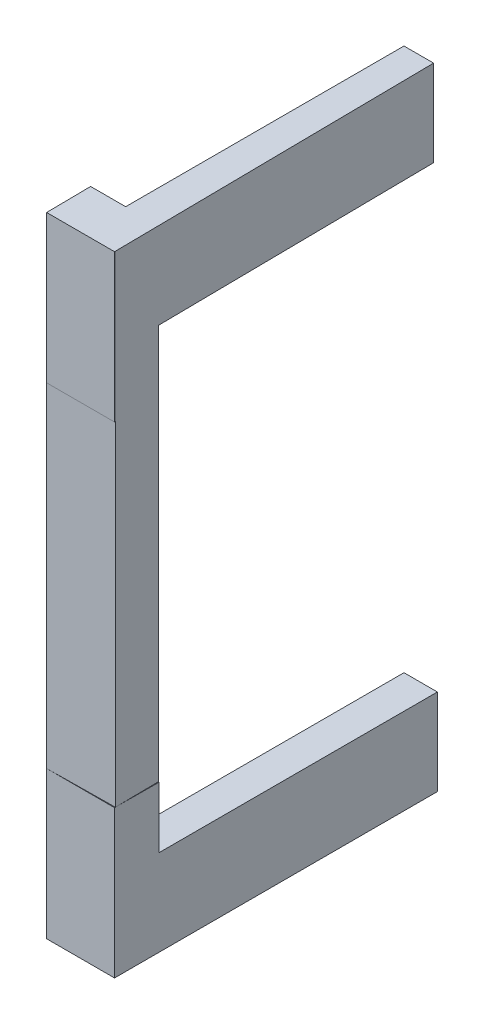
ISO-10303-21;
HEADER;
FILE_DESCRIPTION(('STEP AP214'),'2;1');
FILE_NAME('part.step','',(''),(''),'','','');
FILE_SCHEMA(('AUTOMOTIVE_DESIGN { 1 0 10303 214 1 1 1 1 }'));
ENDSEC;
DATA;
#1=APPLICATION_CONTEXT('core data for automotive mechanical design processes');
#2=APPLICATION_PROTOCOL_DEFINITION('international standard','automotive_design',2000,#1);
#3=PRODUCT_CONTEXT('',#1,'mechanical');
#4=PRODUCT('Part','Part','',(#3));
#5=PRODUCT_RELATED_PRODUCT_CATEGORY('part','',(#4));
#6=PRODUCT_DEFINITION_FORMATION('','',#4);
#7=PRODUCT_DEFINITION_CONTEXT('part definition',#1,'design');
#8=PRODUCT_DEFINITION('design','',#6,#7);
#9=PRODUCT_DEFINITION_SHAPE('','',#8);
#10=(LENGTH_UNIT() NAMED_UNIT(*) SI_UNIT(.MILLI.,.METRE.));
#11=(NAMED_UNIT(*) PLANE_ANGLE_UNIT() SI_UNIT($,.RADIAN.));
#12=(NAMED_UNIT(*) SI_UNIT($,.STERADIAN.) SOLID_ANGLE_UNIT());
#13=UNCERTAINTY_MEASURE_WITH_UNIT(LENGTH_MEASURE(1.E-05),#10,'distance_accuracy_value','');
#14=(GEOMETRIC_REPRESENTATION_CONTEXT(3) GLOBAL_UNCERTAINTY_ASSIGNED_CONTEXT((#13)) GLOBAL_UNIT_ASSIGNED_CONTEXT((#10,
#11,#12)) REPRESENTATION_CONTEXT('',''));
#15=CARTESIAN_POINT('',(0.,0.,0.));
#16=DIRECTION('',(0.,0.,1.));
#17=DIRECTION('',(1.,0.,0.));
#18=AXIS2_PLACEMENT_3D('',#15,#16,#17);
#19=CARTESIAN_POINT('',(-13.1,30.,-12.8));
#20=DIRECTION('',(0.,0.,-1.));
#21=DIRECTION('',(-1.,0.,0.));
#22=AXIS2_PLACEMENT_3D('',#19,#20,#21);
#23=PLANE('',#22);
#24=DIRECTION('',(0.,-1.,0.));
#25=VECTOR('',#24,1.);
#26=CARTESIAN_POINT('',(-10.9998132817287,-5.5,-12.8));
#27=LINE('',#26,#25);
#28=CARTESIAN_POINT('',(-10.9998132817287,0.,-12.8));
#29=VERTEX_POINT('',#28);
#30=CARTESIAN_POINT('',(-10.9998132817287,-13.25,-12.8));
#31=VERTEX_POINT('',#30);
#32=EDGE_CURVE('E236',#29,#31,#27,.T.);
#33=ORIENTED_EDGE('',*,*,#32,.F.);
#34=DIRECTION('',(1.,0.,0.));
#35=VECTOR('',#34,1.);
#36=CARTESIAN_POINT('',(0.,0.,-12.8));
#37=LINE('',#36,#35);
#38=CARTESIAN_POINT('',(-17.1002746487741,0.,-12.8));
#39=VERTEX_POINT('',#38);
#40=EDGE_CURVE('E164',#39,#29,#37,.T.);
#41=ORIENTED_EDGE('',*,*,#40,.F.);
#42=DIRECTION('',(0.,-1.,0.));
#43=VECTOR('',#42,1.);
#44=CARTESIAN_POINT('',(-17.1002746487741,-13.25,-12.8));
#45=LINE('',#44,#43);
#46=CARTESIAN_POINT('',(-17.1002746487741,-13.25,-12.8));
#47=VERTEX_POINT('',#46);
#48=EDGE_CURVE('E191',#39,#47,#45,.T.);
#49=ORIENTED_EDGE('',*,*,#48,.T.);
#50=DIRECTION('',(-1.,0.,0.));
#51=VECTOR('',#50,1.);
#52=CARTESIAN_POINT('',(-10.9998132817287,-13.25,-12.8));
#53=LINE('',#52,#51);
#54=EDGE_CURVE('E184',#31,#47,#53,.T.);
#55=ORIENTED_EDGE('',*,*,#54,.F.);
#56=EDGE_LOOP('',(#33,#41,#49,#55));
#57=FACE_BOUND('',#56,.T.);
#58=ADVANCED_FACE('F33',(#57),#23,.F.);
#59=CARTESIAN_POINT('',(-13.9998132817287,35.5,-12.8));
#60=DIRECTION('',(-1.,0.,0.));
#61=DIRECTION('',(0.,0.,1.));
#62=AXIS2_PLACEMENT_3D('',#59,#60,#61);
#63=PLANE('',#62);
#64=DIRECTION('',(0.,0.,1.));
#65=VECTOR('',#64,1.);
#66=CARTESIAN_POINT('',(-13.9998132817287,-13.25,-41.8));
#67=LINE('',#66,#65);
#68=CARTESIAN_POINT('',(-13.9998132817287,-13.25,-41.8));
#69=VERTEX_POINT('',#68);
#70=CARTESIAN_POINT('',(-13.9998132817287,-13.25,-16.8));
#71=VERTEX_POINT('',#70);
#72=EDGE_CURVE('E56',#69,#71,#67,.T.);
#73=ORIENTED_EDGE('',*,*,#72,.T.);
#74=DIRECTION('',(0.,-1.,0.));
#75=VECTOR('',#74,1.);
#76=CARTESIAN_POINT('',(-13.9998132817287,43.25,-16.8));
#77=LINE('',#76,#75);
#78=CARTESIAN_POINT('',(-13.9998132817287,-5.5,-16.8));
#79=VERTEX_POINT('',#78);
#80=EDGE_CURVE('E169',#79,#71,#77,.T.);
#81=ORIENTED_EDGE('',*,*,#80,.F.);
#82=DIRECTION('',(0.,0.,1.));
#83=VECTOR('',#82,1.);
#84=CARTESIAN_POINT('',(-13.9998132817287,-5.50000000000001,-41.8));
#85=LINE('',#84,#83);
#86=CARTESIAN_POINT('',(-13.9998132817287,-5.50000000000001,-41.8));
#87=VERTEX_POINT('',#86);
#88=EDGE_CURVE('E206',#87,#79,#85,.T.);
#89=ORIENTED_EDGE('',*,*,#88,.F.);
#90=DIRECTION('',(0.,1.,0.));
#91=VECTOR('',#90,1.);
#92=CARTESIAN_POINT('',(-13.9998132817287,-5.50000000000001,-41.8));
#93=LINE('',#92,#91);
#94=EDGE_CURVE('E200',#69,#87,#93,.T.);
#95=ORIENTED_EDGE('',*,*,#94,.F.);
#96=EDGE_LOOP('',(#73,#81,#89,#95));
#97=FACE_BOUND('',#96,.T.);
#98=ADVANCED_FACE('F305',(#97),#63,.T.);
#99=DIRECTION('',(0.,0.,1.));
#100=VECTOR('',#99,1.);
#101=CARTESIAN_POINT('',(-13.9998132817287,35.5,-41.8));
#102=LINE('',#101,#100);
#103=CARTESIAN_POINT('',(-13.9998132817287,35.5,-41.8));
#104=VERTEX_POINT('',#103);
#105=CARTESIAN_POINT('',(-13.9998132817287,35.5,-16.8));
#106=VERTEX_POINT('',#105);
#107=EDGE_CURVE('E228',#104,#106,#102,.T.);
#108=ORIENTED_EDGE('',*,*,#107,.T.);
#109=CARTESIAN_POINT('',(-13.9998132817287,43.25,-16.8));
#110=VERTEX_POINT('',#109);
#111=EDGE_CURVE('E172',#110,#106,#77,.T.);
#112=ORIENTED_EDGE('',*,*,#111,.F.);
#113=DIRECTION('',(0.,0.,1.));
#114=VECTOR('',#113,1.);
#115=CARTESIAN_POINT('',(-13.9998132817287,43.25,-41.8));
#116=LINE('',#115,#114);
#117=CARTESIAN_POINT('',(-13.9998132817287,43.25,-41.8));
#118=VERTEX_POINT('',#117);
#119=EDGE_CURVE('E225',#118,#110,#116,.T.);
#120=ORIENTED_EDGE('',*,*,#119,.F.);
#121=DIRECTION('',(0.,1.,0.));
#122=VECTOR('',#121,1.);
#123=CARTESIAN_POINT('',(-13.9998132817287,35.5,-41.8));
#124=LINE('',#123,#122);
#125=EDGE_CURVE('E218',#104,#118,#124,.T.);
#126=ORIENTED_EDGE('',*,*,#125,.F.);
#127=EDGE_LOOP('',(#108,#112,#120,#126));
#128=FACE_BOUND('',#127,.T.);
#129=ADVANCED_FACE('F277',(#128),#63,.T.);
#130=DIRECTION('',(1.,0.,0.));
#131=VECTOR('',#130,1.);
#132=CARTESIAN_POINT('',(0.,30.,-12.8));
#133=LINE('',#132,#131);
#134=CARTESIAN_POINT('',(-17.1002746487741,30.,-12.8));
#135=VERTEX_POINT('',#134);
#136=CARTESIAN_POINT('',(-10.9998132817287,30.,-12.8));
#137=VERTEX_POINT('',#136);
#138=EDGE_CURVE('E235',#135,#137,#133,.T.);
#139=ORIENTED_EDGE('',*,*,#138,.T.);
#140=CARTESIAN_POINT('',(-10.9998132817287,43.25,-12.8));
#141=VERTEX_POINT('',#140);
#142=EDGE_CURVE('E232',#141,#137,#27,.T.);
#143=ORIENTED_EDGE('',*,*,#142,.F.);
#144=DIRECTION('',(1.,0.,0.));
#145=VECTOR('',#144,1.);
#146=CARTESIAN_POINT('',(-10.9998132817287,43.25,-12.8));
#147=LINE('',#146,#145);
#148=CARTESIAN_POINT('',(-17.1002746487741,43.25,-12.8));
#149=VERTEX_POINT('',#148);
#150=EDGE_CURVE('E213',#149,#141,#147,.T.);
#151=ORIENTED_EDGE('',*,*,#150,.F.);
#152=EDGE_CURVE('E182',#149,#135,#45,.T.);
#153=ORIENTED_EDGE('',*,*,#152,.T.);
#154=EDGE_LOOP('',(#139,#143,#151,#153));
#155=FACE_BOUND('',#154,.T.);
#156=ADVANCED_FACE('F35',(#155),#23,.F.);
#157=CARTESIAN_POINT('',(-17.1471496487741,30.,-16.8));
#158=DIRECTION('',(0.,0.,1.));
#159=DIRECTION('',(1.,0.,0.));
#160=AXIS2_PLACEMENT_3D('',#157,#158,#159);
#161=PLANE('',#160);
#162=DIRECTION('',(0.,-1.,0.));
#163=VECTOR('',#162,1.);
#164=CARTESIAN_POINT('',(-11.0458505108501,30.,-16.8));
#165=LINE('',#164,#163);
#166=CARTESIAN_POINT('',(-11.0458505108501,35.5,-16.8));
#167=VERTEX_POINT('',#166);
#168=CARTESIAN_POINT('',(-11.0458505108501,0.,-16.8));
#169=VERTEX_POINT('',#168);
#170=EDGE_CURVE('E285',#167,#169,#165,.T.);
#171=ORIENTED_EDGE('',*,*,#170,.T.);
#172=DIRECTION('',(0.956445869362801,-0.291909744576703,0.));
#173=VECTOR('',#172,1.);
#174=CARTESIAN_POINT('',(-25.0031261065873,4.25979648681284,-16.8));
#175=LINE('',#174,#173);
#176=CARTESIAN_POINT('',(-10.9998132817287,-0.0140506809891763,-16.8));
#177=VERTEX_POINT('',#176);
#178=EDGE_CURVE('E141',#169,#177,#175,.T.);
#179=ORIENTED_EDGE('',*,*,#178,.T.);
#180=DIRECTION('',(0.,-1.,0.));
#181=VECTOR('',#180,1.);
#182=CARTESIAN_POINT('',(-10.9998132817287,-5.5,-16.8));
#183=LINE('',#182,#181);
#184=CARTESIAN_POINT('',(-10.9998132817287,-5.50000000000001,-16.8));
#185=VERTEX_POINT('',#184);
#186=EDGE_CURVE('E158',#177,#185,#183,.T.);
#187=ORIENTED_EDGE('',*,*,#186,.T.);
#188=DIRECTION('',(-1.,0.,0.));
#189=VECTOR('',#188,1.);
#190=CARTESIAN_POINT('',(-10.9998132817287,-5.5,-16.8));
#191=LINE('',#190,#189);
#192=EDGE_CURVE('E231',#185,#79,#191,.T.);
#193=ORIENTED_EDGE('',*,*,#192,.T.);
#194=ORIENTED_EDGE('',*,*,#80,.T.);
#195=DIRECTION('',(1.,0.,0.));
#196=VECTOR('',#195,1.);
#197=CARTESIAN_POINT('',(-73.7670726534593,-13.25,-16.8));
#198=LINE('',#197,#196);
#199=CARTESIAN_POINT('',(-17.1471496487741,-13.25,-16.8));
#200=VERTEX_POINT('',#199);
#201=EDGE_CURVE('E186',#200,#71,#198,.T.);
#202=ORIENTED_EDGE('',*,*,#201,.F.);
#203=DIRECTION('',(0.,-1.,0.));
#204=VECTOR('',#203,1.);
#205=CARTESIAN_POINT('',(-17.1471496487741,30.,-16.8));
#206=LINE('',#205,#204);
#207=CARTESIAN_POINT('',(-17.1471496487741,43.25,-16.8));
#208=VERTEX_POINT('',#207);
#209=EDGE_CURVE('E247',#208,#200,#206,.T.);
#210=ORIENTED_EDGE('',*,*,#209,.F.);
#211=DIRECTION('',(1.,0.,0.));
#212=VECTOR('',#211,1.);
#213=CARTESIAN_POINT('',(-73.7670726534593,43.25,-16.8));
#214=LINE('',#213,#212);
#215=EDGE_CURVE('E189',#208,#110,#214,.T.);
#216=ORIENTED_EDGE('',*,*,#215,.T.);
#217=ORIENTED_EDGE('',*,*,#111,.T.);
#218=DIRECTION('',(1.,0.,0.));
#219=VECTOR('',#218,1.);
#220=CARTESIAN_POINT('',(-10.9998132817287,35.5,-16.8));
#221=LINE('',#220,#219);
#222=EDGE_CURVE('E239',#106,#167,#221,.T.);
#223=ORIENTED_EDGE('',*,*,#222,.T.);
#224=EDGE_LOOP('',(#171,#179,#187,#193,#194,#202,#210,#216,#217,#223));
#225=FACE_BOUND('',#224,.T.);
#226=ADVANCED_FACE('F258',(#225),#161,.F.);
#227=CARTESIAN_POINT('',(-16.7997253700826,30.,12.8468717816807));
#228=DIRECTION('',(0.99993134252064,0.,-0.0117179454201639));
#229=DIRECTION('',(-0.0117179454201639,0.,-0.99993134252064));
#230=AXIS2_PLACEMENT_3D('',#227,#228,#229);
#231=PLANE('',#230);
#232=ORIENTED_EDGE('',*,*,#48,.F.);
#233=DIRECTION('',(0.,-1.,0.));
#234=VECTOR('',#233,1.);
#235=CARTESIAN_POINT('',(-17.1002746487741,30.,-12.8));
#236=LINE('',#235,#234);
#237=EDGE_CURVE('E168',#135,#39,#236,.T.);
#238=ORIENTED_EDGE('',*,*,#237,.F.);
#239=ORIENTED_EDGE('',*,*,#152,.F.);
#240=DIRECTION('',(0.0117179454201639,0.,0.99993134252064));
#241=VECTOR('',#240,1.);
#242=CARTESIAN_POINT('',(-17.1080555806842,43.25,-13.4639728563216));
#243=LINE('',#242,#241);
#244=EDGE_CURVE('E181',#208,#149,#243,.T.);
#245=ORIENTED_EDGE('',*,*,#244,.F.);
#246=ORIENTED_EDGE('',*,*,#209,.T.);
#247=DIRECTION('',(-0.0117179454201639,0.,-0.99993134252064));
#248=VECTOR('',#247,1.);
#249=CARTESIAN_POINT('',(-17.1080555806842,-13.25,-13.4639728563216));
#250=LINE('',#249,#248);
#251=EDGE_CURVE('E178',#47,#200,#250,.T.);
#252=ORIENTED_EDGE('',*,*,#251,.F.);
#253=EDGE_LOOP('',(#232,#238,#239,#245,#246,#252));
#254=FACE_BOUND('',#253,.T.);
#255=ADVANCED_FACE('F254',(#254),#231,.F.);
#256=CARTESIAN_POINT('',(-10.9998132817287,-5.5,-12.8));
#257=DIRECTION('',(1.,0.,0.));
#258=DIRECTION('',(0.,1.,0.));
#259=AXIS2_PLACEMENT_3D('',#256,#257,#258);
#260=PLANE('',#259);
#261=DIRECTION('',(0.,-0.00357656982948041,-0.999993604053673));
#262=VECTOR('',#261,1.);
#263=CARTESIAN_POINT('',(-10.9998132817287,0.000185331376181472,-12.8196719227333));
#264=LINE('',#263,#262);
#265=CARTESIAN_POINT('',(-10.9998132817287,0.,-12.8714897816451));
#266=VERTEX_POINT('',#265);
#267=EDGE_CURVE('E11',#266,#177,#264,.T.);
#268=ORIENTED_EDGE('',*,*,#267,.F.);
#269=DIRECTION('',(0.,0.,-1.));
#270=VECTOR('',#269,1.);
#271=CARTESIAN_POINT('',(-10.9998132817287,0.,0.));
#272=LINE('',#271,#270);
#273=EDGE_CURVE('E150',#29,#266,#272,.T.);
#274=ORIENTED_EDGE('',*,*,#273,.F.);
#275=ORIENTED_EDGE('',*,*,#32,.T.);
#276=DIRECTION('',(0.,0.,1.));
#277=VECTOR('',#276,1.);
#278=CARTESIAN_POINT('',(-10.9998132817287,-13.25,-41.8));
#279=LINE('',#278,#277);
#280=CARTESIAN_POINT('',(-10.9998132817287,-13.25,-41.8));
#281=VERTEX_POINT('',#280);
#282=EDGE_CURVE('E210',#281,#31,#279,.T.);
#283=ORIENTED_EDGE('',*,*,#282,.F.);
#284=DIRECTION('',(0.,-1.,0.));
#285=VECTOR('',#284,1.);
#286=CARTESIAN_POINT('',(-10.9998132817287,-5.50000000000001,-41.8));
#287=LINE('',#286,#285);
#288=CARTESIAN_POINT('',(-10.9998132817287,-5.50000000000001,-41.8));
#289=VERTEX_POINT('',#288);
#290=EDGE_CURVE('E195',#289,#281,#287,.T.);
#291=ORIENTED_EDGE('',*,*,#290,.F.);
#292=DIRECTION('',(0.,0.,1.));
#293=VECTOR('',#292,1.);
#294=CARTESIAN_POINT('',(-10.9998132817287,-5.50000000000001,-41.8));
#295=LINE('',#294,#293);
#296=EDGE_CURVE('E204',#289,#185,#295,.T.);
#297=ORIENTED_EDGE('',*,*,#296,.T.);
#298=ORIENTED_EDGE('',*,*,#186,.F.);
#299=EDGE_LOOP('',(#268,#274,#275,#283,#291,#297,#298));
#300=FACE_BOUND('',#299,.T.);
#301=ADVANCED_FACE('F155',(#300),#260,.T.);
#302=DIRECTION('',(0.,-1.,0.));
#303=VECTOR('',#302,1.);
#304=CARTESIAN_POINT('',(-10.9998132817287,0.,-12.8714897816451));
#305=LINE('',#304,#303);
#306=CARTESIAN_POINT('',(-10.9998132817287,43.25,-12.8714897816451));
#307=VERTEX_POINT('',#306);
#308=CARTESIAN_POINT('',(-10.9998132817287,30.,-12.8714897816451));
#309=VERTEX_POINT('',#308);
#310=EDGE_CURVE('E48',#307,#309,#305,.T.);
#311=ORIENTED_EDGE('',*,*,#310,.F.);
#312=DIRECTION('',(0.,0.,1.));
#313=VECTOR('',#312,1.);
#314=CARTESIAN_POINT('',(-10.9998132817287,43.25,-41.8));
#315=LINE('',#314,#313);
#316=EDGE_CURVE('E223',#307,#141,#315,.T.);
#317=ORIENTED_EDGE('',*,*,#316,.T.);
#318=ORIENTED_EDGE('',*,*,#142,.T.);
#319=DIRECTION('',(0.,0.,-1.));
#320=VECTOR('',#319,1.);
#321=CARTESIAN_POINT('',(-10.9998132817287,30.,0.));
#322=LINE('',#321,#320);
#323=EDGE_CURVE('E244',#137,#309,#322,.T.);
#324=ORIENTED_EDGE('',*,*,#323,.T.);
#325=EDGE_LOOP('',(#311,#317,#318,#324));
#326=FACE_BOUND('',#325,.T.);
#327=ADVANCED_FACE('F319',(#326),#260,.T.);
#328=CARTESIAN_POINT('',(-10.9998132817287,35.5,-41.8));
#329=DIRECTION('',(0.,1.,0.));
#330=DIRECTION('',(0.,0.,1.));
#331=AXIS2_PLACEMENT_3D('',#328,#329,#330);
#332=PLANE('',#331);
#333=DIRECTION('',(-1.,0.,0.));
#334=VECTOR('',#333,1.);
#335=CARTESIAN_POINT('',(-10.9998132817287,35.5,-41.8));
#336=LINE('',#335,#334);
#337=CARTESIAN_POINT('',(-11.3388192608501,35.5,-41.8));
#338=VERTEX_POINT('',#337);
#339=EDGE_CURVE('E216',#338,#104,#336,.T.);
#340=ORIENTED_EDGE('',*,*,#339,.F.);
#341=DIRECTION('',(0.0117179454201639,0.,0.99993134252064));
#342=VECTOR('',#341,1.);
#343=CARTESIAN_POINT('',(-11.3387727118561,35.5,-41.7960278191782));
#344=LINE('',#343,#342);
#345=EDGE_CURVE('E284',#338,#167,#344,.T.);
#346=ORIENTED_EDGE('',*,*,#345,.T.);
#347=ORIENTED_EDGE('',*,*,#222,.F.);
#348=ORIENTED_EDGE('',*,*,#107,.F.);
#349=EDGE_LOOP('',(#340,#346,#347,#348));
#350=FACE_BOUND('',#349,.T.);
#351=ADVANCED_FACE('F282',(#350),#332,.F.);
#352=CARTESIAN_POINT('',(-10.9998132817287,43.25,-41.8));
#353=DIRECTION('',(0.,-1.,0.));
#354=DIRECTION('',(0.,0.,-1.));
#355=AXIS2_PLACEMENT_3D('',#352,#353,#354);
#356=PLANE('',#355);
#357=ORIENTED_EDGE('',*,*,#316,.F.);
#358=DIRECTION('',(-0.0117179454201639,0.,-0.99993134252064));
#359=VECTOR('',#358,1.);
#360=CARTESIAN_POINT('',(-11.3387727118561,43.25,-41.7960278191782));
#361=LINE('',#360,#359);
#362=CARTESIAN_POINT('',(-11.3388192608501,43.25,-41.8));
#363=VERTEX_POINT('',#362);
#364=EDGE_CURVE('E287',#307,#363,#361,.T.);
#365=ORIENTED_EDGE('',*,*,#364,.T.);
#366=DIRECTION('',(1.,0.,0.));
#367=VECTOR('',#366,1.);
#368=CARTESIAN_POINT('',(-10.9998132817287,43.25,-41.8));
#369=LINE('',#368,#367);
#370=EDGE_CURVE('E220',#118,#363,#369,.T.);
#371=ORIENTED_EDGE('',*,*,#370,.F.);
#372=ORIENTED_EDGE('',*,*,#119,.T.);
#373=ORIENTED_EDGE('',*,*,#215,.F.);
#374=ORIENTED_EDGE('',*,*,#244,.T.);
#375=ORIENTED_EDGE('',*,*,#150,.T.);
#376=EDGE_LOOP('',(#357,#365,#371,#372,#373,#374,#375));
#377=FACE_BOUND('',#376,.T.);
#378=ADVANCED_FACE('F270',(#377),#356,.F.);
#379=CARTESIAN_POINT('',(0.,0.,-41.8));
#380=DIRECTION('',(0.,0.,-1.));
#381=DIRECTION('',(-1.,0.,0.));
#382=AXIS2_PLACEMENT_3D('',#379,#380,#381);
#383=PLANE('',#382);
#384=DIRECTION('',(0.,1.,0.));
#385=VECTOR('',#384,1.);
#386=CARTESIAN_POINT('',(-11.3388192608501,0.,-41.8));
#387=LINE('',#386,#385);
#388=EDGE_CURVE('E143',#338,#363,#387,.T.);
#389=ORIENTED_EDGE('',*,*,#388,.F.);
#390=ORIENTED_EDGE('',*,*,#339,.T.);
#391=ORIENTED_EDGE('',*,*,#125,.T.);
#392=ORIENTED_EDGE('',*,*,#370,.T.);
#393=EDGE_LOOP('',(#389,#390,#391,#392));
#394=FACE_BOUND('',#393,.T.);
#395=ADVANCED_FACE('F294',(#394),#383,.T.);
#396=CARTESIAN_POINT('',(-10.9998132817287,-13.25,-41.8));
#397=DIRECTION('',(0.,1.,0.));
#398=DIRECTION('',(0.,0.,1.));
#399=AXIS2_PLACEMENT_3D('',#396,#397,#398);
#400=PLANE('',#399);
#401=ORIENTED_EDGE('',*,*,#282,.T.);
#402=ORIENTED_EDGE('',*,*,#54,.T.);
#403=ORIENTED_EDGE('',*,*,#251,.T.);
#404=ORIENTED_EDGE('',*,*,#201,.T.);
#405=ORIENTED_EDGE('',*,*,#72,.F.);
#406=DIRECTION('',(-1.,0.,0.));
#407=VECTOR('',#406,1.);
#408=CARTESIAN_POINT('',(-10.9998132817287,-13.25,-41.8));
#409=LINE('',#408,#407);
#410=EDGE_CURVE('E198',#281,#69,#409,.T.);
#411=ORIENTED_EDGE('',*,*,#410,.F.);
#412=EDGE_LOOP('',(#401,#402,#403,#404,#405,#411));
#413=FACE_BOUND('',#412,.T.);
#414=ADVANCED_FACE('F260',(#413),#400,.F.);
#415=CARTESIAN_POINT('',(-10.9998132817287,-5.50000000000001,-41.8));
#416=DIRECTION('',(0.,-1.,0.));
#417=DIRECTION('',(0.,0.,-1.));
#418=AXIS2_PLACEMENT_3D('',#415,#416,#417);
#419=PLANE('',#418);
#420=ORIENTED_EDGE('',*,*,#192,.F.);
#421=ORIENTED_EDGE('',*,*,#296,.F.);
#422=DIRECTION('',(1.,0.,0.));
#423=VECTOR('',#422,1.);
#424=CARTESIAN_POINT('',(-10.9998132817287,-5.50000000000001,-41.8));
#425=LINE('',#424,#423);
#426=EDGE_CURVE('E202',#87,#289,#425,.T.);
#427=ORIENTED_EDGE('',*,*,#426,.F.);
#428=ORIENTED_EDGE('',*,*,#88,.T.);
#429=EDGE_LOOP('',(#420,#421,#427,#428));
#430=FACE_BOUND('',#429,.T.);
#431=ADVANCED_FACE('F301',(#430),#419,.F.);
#432=CARTESIAN_POINT('',(0.,0.,-41.8));
#433=DIRECTION('',(0.,0.,-1.));
#434=DIRECTION('',(-1.,0.,0.));
#435=AXIS2_PLACEMENT_3D('',#432,#433,#434);
#436=PLANE('',#435);
#437=ORIENTED_EDGE('',*,*,#290,.T.);
#438=ORIENTED_EDGE('',*,*,#410,.T.);
#439=ORIENTED_EDGE('',*,*,#94,.T.);
#440=ORIENTED_EDGE('',*,*,#426,.T.);
#441=EDGE_LOOP('',(#437,#438,#439,#440));
#442=FACE_BOUND('',#441,.T.);
#443=ADVANCED_FACE('F344',(#442),#436,.T.);
#444=CARTESIAN_POINT('',(29.896498449696,30.,-13.3507434347477));
#445=DIRECTION('',(-0.0117179454201639,0.,-0.99993134252064));
#446=DIRECTION('',(-0.99993134252064,0.,0.0117179454201639));
#447=AXIS2_PLACEMENT_3D('',#444,#445,#446);
#448=PLANE('',#447);
#449=DIRECTION('',(-0.99993134252064,0.,0.0117179454201639));
#450=VECTOR('',#449,1.);
#451=CARTESIAN_POINT('',(29.896498449696,0.,-13.3507434347477));
#452=LINE('',#451,#450);
#453=EDGE_CURVE('E161',#266,#39,#452,.T.);
#454=ORIENTED_EDGE('',*,*,#453,.F.);
#455=DIRECTION('',(0.,1.,0.));
#456=VECTOR('',#455,1.);
#457=CARTESIAN_POINT('',(-10.9998132817287,30.,-12.8714897816451));
#458=LINE('',#457,#456);
#459=EDGE_CURVE('E41',#266,#309,#458,.T.);
#460=ORIENTED_EDGE('',*,*,#459,.T.);
#461=DIRECTION('',(-0.99993134252064,0.,0.0117179454201639));
#462=VECTOR('',#461,1.);
#463=CARTESIAN_POINT('',(29.896498449696,30.,-13.3507434347477));
#464=LINE('',#463,#462);
#465=EDGE_CURVE('E170',#309,#135,#464,.T.);
#466=ORIENTED_EDGE('',*,*,#465,.T.);
#467=ORIENTED_EDGE('',*,*,#237,.T.);
#468=EDGE_LOOP('',(#454,#460,#466,#467));
#469=FACE_BOUND('',#468,.T.);
#470=ADVANCED_FACE('F166',(#469),#448,.F.);
#471=CARTESIAN_POINT('',(29.896498449696,0.,-13.3507434347477));
#472=DIRECTION('',(0.,-1.,0.));
#473=DIRECTION('',(0.,0.,-1.));
#474=AXIS2_PLACEMENT_3D('',#471,#472,#473);
#475=PLANE('',#474);
#476=ORIENTED_EDGE('',*,*,#40,.T.);
#477=ORIENTED_EDGE('',*,*,#273,.T.);
#478=ORIENTED_EDGE('',*,*,#453,.T.);
#479=EDGE_LOOP('',(#476,#477,#478));
#480=FACE_BOUND('',#479,.T.);
#481=ADVANCED_FACE('F160',(#480),#475,.F.);
#482=CARTESIAN_POINT('',(30.2341068659758,30.,15.4585080878001));
#483=DIRECTION('',(0.,1.,0.));
#484=DIRECTION('',(0.,0.,1.));
#485=AXIS2_PLACEMENT_3D('',#482,#483,#484);
#486=PLANE('',#485);
#487=ORIENTED_EDGE('',*,*,#465,.F.);
#488=ORIENTED_EDGE('',*,*,#323,.F.);
#489=ORIENTED_EDGE('',*,*,#138,.F.);
#490=EDGE_LOOP('',(#487,#488,#489));
#491=FACE_BOUND('',#490,.T.);
#492=ADVANCED_FACE('F333',(#491),#486,.F.);
#493=CARTESIAN_POINT('',(23.2623578244193,-10.6264503689601,-60.2762267223913));
#494=DIRECTION('',(-0.291908036629071,-0.956440273251375,0.00342079730424682));
#495=DIRECTION('',(0.956445869362801,-0.291909744576703,0.));
#496=AXIS2_PLACEMENT_3D('',#493,#494,#495);
#497=PLANE('',#496);
#498=DIRECTION('',(0.0117179454201639,0.,0.99993134252064));
#499=VECTOR('',#498,1.);
#500=CARTESIAN_POINT('',(-11.5505567164764,0.,-59.8682628801152));
#501=LINE('',#500,#499);
#502=EDGE_CURVE('E137',#169,#266,#501,.T.);
#503=ORIENTED_EDGE('',*,*,#502,.T.);
#504=ORIENTED_EDGE('',*,*,#267,.T.);
#505=ORIENTED_EDGE('',*,*,#178,.F.);
#506=EDGE_LOOP('',(#503,#504,#505));
#507=FACE_BOUND('',#506,.T.);
#508=ADVANCED_FACE('F138',(#507),#497,.F.);
#509=CARTESIAN_POINT('',(-11.5505567164764,0.,-59.8682628801152));
#510=DIRECTION('',(-0.99993134252064,0.,0.0117179454201639));
#511=DIRECTION('',(0.0117179454201639,0.,0.99993134252064));
#512=AXIS2_PLACEMENT_3D('',#509,#510,#511);
#513=PLANE('',#512);
#514=ORIENTED_EDGE('',*,*,#345,.F.);
#515=ORIENTED_EDGE('',*,*,#388,.T.);
#516=ORIENTED_EDGE('',*,*,#364,.F.);
#517=ORIENTED_EDGE('',*,*,#310,.T.);
#518=ORIENTED_EDGE('',*,*,#459,.F.);
#519=ORIENTED_EDGE('',*,*,#502,.F.);
#520=ORIENTED_EDGE('',*,*,#170,.F.);
#521=EDGE_LOOP('',(#514,#515,#516,#517,#518,#519,#520));
#522=FACE_BOUND('',#521,.T.);
#523=ADVANCED_FACE('F145',(#522),#513,.F.);
#524=CLOSED_SHELL('',(#58,#98,#129,#156,#226,#255,#301,#327,#351,#378,#395,#414,#431,#443,#470,
#481,#492,#508,#523));
#525=MANIFOLD_SOLID_BREP('B2',#524);
#526=ADVANCED_BREP_SHAPE_REPRESENTATION('',(#18,#525),#14);
#527=SHAPE_DEFINITION_REPRESENTATION(#9,#526);
ENDSEC;
END-ISO-10303-21;
